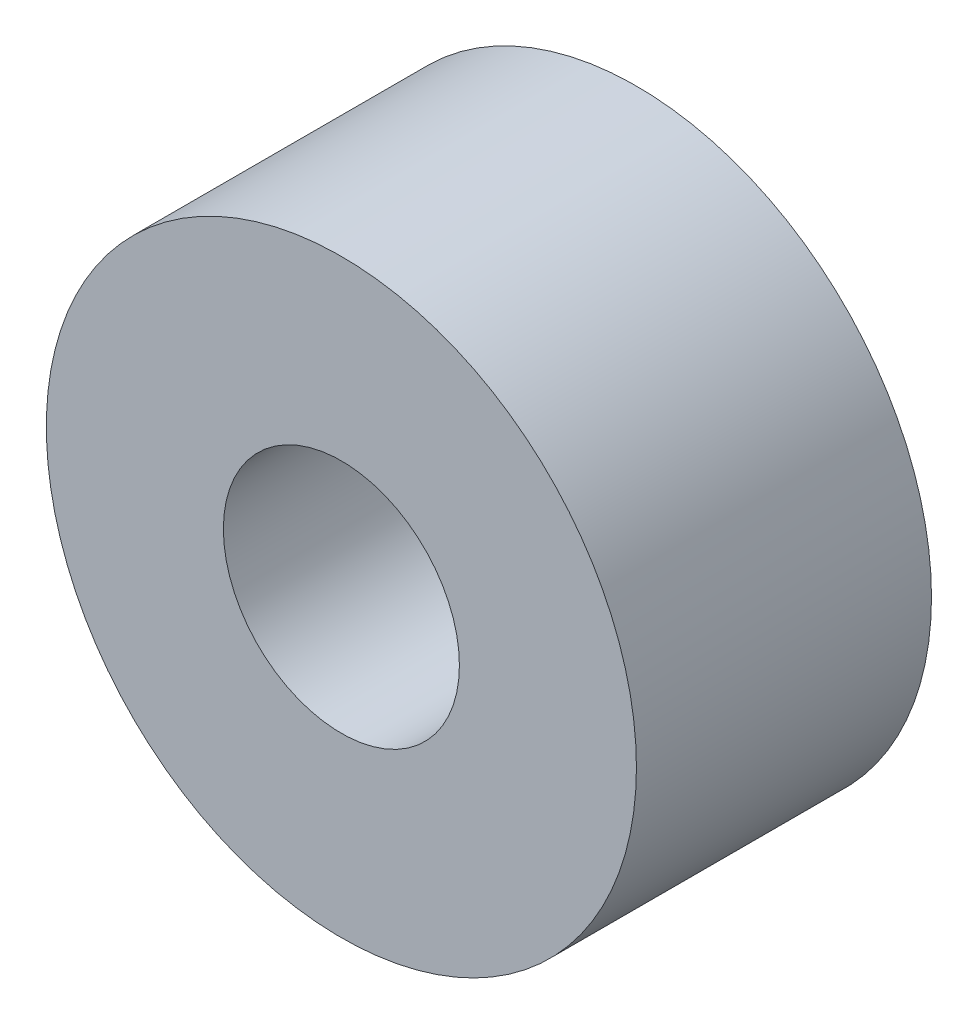
ISO-10303-21;
HEADER;
FILE_DESCRIPTION(('STEP AP214'),'2;1');
FILE_NAME('part.step','',(''),(''),'','','');
FILE_SCHEMA(('AUTOMOTIVE_DESIGN { 1 0 10303 214 1 1 1 1 }'));
ENDSEC;
DATA;
#1=APPLICATION_CONTEXT('core data for automotive mechanical design processes');
#2=APPLICATION_PROTOCOL_DEFINITION('international standard','automotive_design',2000,#1);
#3=PRODUCT_CONTEXT('',#1,'mechanical');
#4=PRODUCT('Part','Part','',(#3));
#5=PRODUCT_RELATED_PRODUCT_CATEGORY('part','',(#4));
#6=PRODUCT_DEFINITION_FORMATION('','',#4);
#7=PRODUCT_DEFINITION_CONTEXT('part definition',#1,'design');
#8=PRODUCT_DEFINITION('design','',#6,#7);
#9=PRODUCT_DEFINITION_SHAPE('','',#8);
#10=(LENGTH_UNIT() NAMED_UNIT(*) SI_UNIT(.MILLI.,.METRE.));
#11=(NAMED_UNIT(*) PLANE_ANGLE_UNIT() SI_UNIT($,.RADIAN.));
#12=(NAMED_UNIT(*) SI_UNIT($,.STERADIAN.) SOLID_ANGLE_UNIT());
#13=UNCERTAINTY_MEASURE_WITH_UNIT(LENGTH_MEASURE(1.E-05),#10,'distance_accuracy_value','');
#14=(GEOMETRIC_REPRESENTATION_CONTEXT(3) GLOBAL_UNCERTAINTY_ASSIGNED_CONTEXT((#13)) GLOBAL_UNIT_ASSIGNED_CONTEXT((#10,
#11,#12)) REPRESENTATION_CONTEXT('',''));
#15=CARTESIAN_POINT('',(0.,0.,0.));
#16=DIRECTION('',(0.,0.,1.));
#17=DIRECTION('',(1.,0.,0.));
#18=AXIS2_PLACEMENT_3D('',#15,#16,#17);
#19=CARTESIAN_POINT('',(0.,0.,2.));
#20=DIRECTION('',(0.,0.,1.));
#21=DIRECTION('',(1.,0.,0.));
#22=AXIS2_PLACEMENT_3D('',#19,#20,#21);
#23=PLANE('',#22);
#24=CARTESIAN_POINT('',(0.,0.,2.));
#25=DIRECTION('',(0.,0.,1.));
#26=DIRECTION('',(1.,0.,0.));
#27=AXIS2_PLACEMENT_3D('',#24,#25,#26);
#28=CIRCLE('',#27,4.);
#29=CARTESIAN_POINT('',(4.,0.,2.));
#30=VERTEX_POINT('',#29);
#31=EDGE_CURVE('E10',#30,#30,#28,.T.);
#32=ORIENTED_EDGE('',*,*,#31,.T.);
#33=EDGE_LOOP('',(#32));
#34=FACE_BOUND('',#33,.T.);
#35=CARTESIAN_POINT('',(0.,0.,2.));
#36=DIRECTION('',(0.,0.,1.));
#37=DIRECTION('',(1.,0.,0.));
#38=AXIS2_PLACEMENT_3D('',#35,#36,#37);
#39=CIRCLE('',#38,1.6);
#40=CARTESIAN_POINT('',(1.6,0.,2.));
#41=VERTEX_POINT('',#40);
#42=EDGE_CURVE('E39',#41,#41,#39,.T.);
#43=ORIENTED_EDGE('',*,*,#42,.F.);
#44=EDGE_LOOP('',(#43));
#45=FACE_BOUND('',#44,.T.);
#46=ADVANCED_FACE('F32',(#34,#45),#23,.T.);
#47=CARTESIAN_POINT('',(0.,0.,2.));
#48=DIRECTION('',(0.,0.,-1.));
#49=DIRECTION('',(-1.,0.,0.));
#50=AXIS2_PLACEMENT_3D('',#47,#48,#49);
#51=CYLINDRICAL_SURFACE('',#50,4.);
#52=ORIENTED_EDGE('',*,*,#31,.F.);
#53=EDGE_LOOP('',(#52));
#54=FACE_BOUND('',#53,.T.);
#55=CARTESIAN_POINT('',(0.,0.,-2.));
#56=DIRECTION('',(0.,0.,1.));
#57=DIRECTION('',(1.,0.,0.));
#58=AXIS2_PLACEMENT_3D('',#55,#56,#57);
#59=CIRCLE('',#58,4.);
#60=CARTESIAN_POINT('',(4.,0.,-2.));
#61=VERTEX_POINT('',#60);
#62=EDGE_CURVE('E43',#61,#61,#59,.T.);
#63=ORIENTED_EDGE('',*,*,#62,.T.);
#64=EDGE_LOOP('',(#63));
#65=FACE_BOUND('',#64,.T.);
#66=ADVANCED_FACE('F34',(#54,#65),#51,.T.);
#67=CARTESIAN_POINT('',(0.,0.,2.));
#68=DIRECTION('',(0.,0.,-1.));
#69=DIRECTION('',(-1.,0.,0.));
#70=AXIS2_PLACEMENT_3D('',#67,#68,#69);
#71=CYLINDRICAL_SURFACE('',#70,1.6);
#72=ORIENTED_EDGE('',*,*,#42,.T.);
#73=EDGE_LOOP('',(#72));
#74=FACE_BOUND('',#73,.T.);
#75=CARTESIAN_POINT('',(0.,0.,-2.));
#76=DIRECTION('',(0.,0.,1.));
#77=DIRECTION('',(1.,0.,0.));
#78=AXIS2_PLACEMENT_3D('',#75,#76,#77);
#79=CIRCLE('',#78,1.6);
#80=CARTESIAN_POINT('',(1.6,0.,-2.));
#81=VERTEX_POINT('',#80);
#82=EDGE_CURVE('E47',#81,#81,#79,.T.);
#83=ORIENTED_EDGE('',*,*,#82,.F.);
#84=EDGE_LOOP('',(#83));
#85=FACE_BOUND('',#84,.T.);
#86=ADVANCED_FACE('F56',(#74,#85),#71,.F.);
#87=CARTESIAN_POINT('',(0.,0.,-2.));
#88=DIRECTION('',(0.,0.,1.));
#89=DIRECTION('',(1.,0.,0.));
#90=AXIS2_PLACEMENT_3D('',#87,#88,#89);
#91=PLANE('',#90);
#92=ORIENTED_EDGE('',*,*,#82,.T.);
#93=EDGE_LOOP('',(#92));
#94=FACE_BOUND('',#93,.T.);
#95=ORIENTED_EDGE('',*,*,#62,.F.);
#96=EDGE_LOOP('',(#95));
#97=FACE_BOUND('',#96,.T.);
#98=ADVANCED_FACE('F53',(#94,#97),#91,.F.);
#99=CLOSED_SHELL('',(#46,#66,#86,#98));
#100=MANIFOLD_SOLID_BREP('B2',#99);
#101=ADVANCED_BREP_SHAPE_REPRESENTATION('',(#18,#100),#14);
#102=SHAPE_DEFINITION_REPRESENTATION(#9,#101);
ENDSEC;
END-ISO-10303-21;
